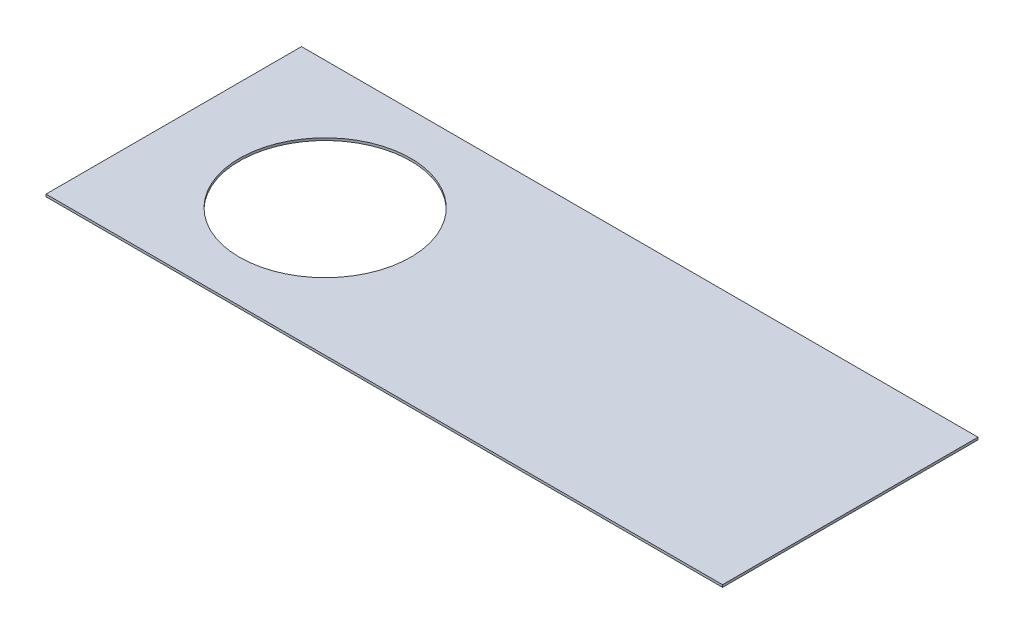
ISO-10303-21;
HEADER;
FILE_DESCRIPTION(('STEP AP214'),'2;1');
FILE_NAME('part.step','',(''),(''),'','','');
FILE_SCHEMA(('AUTOMOTIVE_DESIGN { 1 0 10303 214 1 1 1 1 }'));
ENDSEC;
DATA;
#1=APPLICATION_CONTEXT('core data for automotive mechanical design processes');
#2=APPLICATION_PROTOCOL_DEFINITION('international standard','automotive_design',2000,#1);
#3=PRODUCT_CONTEXT('',#1,'mechanical');
#4=PRODUCT('Part','Part','',(#3));
#5=PRODUCT_RELATED_PRODUCT_CATEGORY('part','',(#4));
#6=PRODUCT_DEFINITION_FORMATION('','',#4);
#7=PRODUCT_DEFINITION_CONTEXT('part definition',#1,'design');
#8=PRODUCT_DEFINITION('design','',#6,#7);
#9=PRODUCT_DEFINITION_SHAPE('','',#8);
#10=(LENGTH_UNIT() NAMED_UNIT(*) SI_UNIT(.MILLI.,.METRE.));
#11=(NAMED_UNIT(*) PLANE_ANGLE_UNIT() SI_UNIT($,.RADIAN.));
#12=(NAMED_UNIT(*) SI_UNIT($,.STERADIAN.) SOLID_ANGLE_UNIT());
#13=UNCERTAINTY_MEASURE_WITH_UNIT(LENGTH_MEASURE(1.E-05),#10,'distance_accuracy_value','');
#14=(GEOMETRIC_REPRESENTATION_CONTEXT(3) GLOBAL_UNCERTAINTY_ASSIGNED_CONTEXT((#13)) GLOBAL_UNIT_ASSIGNED_CONTEXT((#10,
#11,#12)) REPRESENTATION_CONTEXT('',''));
#15=CARTESIAN_POINT('',(0.,0.,0.));
#16=DIRECTION('',(0.,0.,1.));
#17=DIRECTION('',(1.,0.,0.));
#18=AXIS2_PLACEMENT_3D('',#15,#16,#17);
#19=CARTESIAN_POINT('',(0.,1.5875,0.));
#20=DIRECTION('',(1.,0.,0.));
#21=DIRECTION('',(0.,0.,-1.));
#22=AXIS2_PLACEMENT_3D('',#19,#20,#21);
#23=PLANE('',#22);
#24=DIRECTION('',(0.,0.,1.));
#25=VECTOR('',#24,1.);
#26=CARTESIAN_POINT('',(0.,0.,0.));
#27=LINE('',#26,#25);
#28=CARTESIAN_POINT('',(0.,0.,-171.45));
#29=VERTEX_POINT('',#28);
#30=CARTESIAN_POINT('',(0.,0.,0.));
#31=VERTEX_POINT('',#30);
#32=EDGE_CURVE('E105',#29,#31,#27,.T.);
#33=ORIENTED_EDGE('',*,*,#32,.T.);
#34=DIRECTION('',(0.,-1.,0.));
#35=VECTOR('',#34,1.);
#36=CARTESIAN_POINT('',(0.,1.5875,0.));
#37=LINE('',#36,#35);
#38=CARTESIAN_POINT('',(0.,1.5875,0.));
#39=VERTEX_POINT('',#38);
#40=EDGE_CURVE('E11',#39,#31,#37,.T.);
#41=ORIENTED_EDGE('',*,*,#40,.F.);
#42=DIRECTION('',(0.,0.,1.));
#43=VECTOR('',#42,1.);
#44=CARTESIAN_POINT('',(0.,1.5875,0.));
#45=LINE('',#44,#43);
#46=CARTESIAN_POINT('',(0.,1.5875,-171.45));
#47=VERTEX_POINT('',#46);
#48=EDGE_CURVE('E86',#47,#39,#45,.T.);
#49=ORIENTED_EDGE('',*,*,#48,.F.);
#50=DIRECTION('',(0.,-1.,0.));
#51=VECTOR('',#50,1.);
#52=CARTESIAN_POINT('',(0.,1.5875,-171.45));
#53=LINE('',#52,#51);
#54=EDGE_CURVE('E96',#47,#29,#53,.T.);
#55=ORIENTED_EDGE('',*,*,#54,.T.);
#56=EDGE_LOOP('',(#33,#41,#49,#55));
#57=FACE_BOUND('',#56,.T.);
#58=ADVANCED_FACE('F39',(#57),#23,.F.);
#59=CARTESIAN_POINT('',(0.,1.5875,0.));
#60=DIRECTION('',(0.,0.,-1.));
#61=DIRECTION('',(-1.,0.,0.));
#62=AXIS2_PLACEMENT_3D('',#59,#60,#61);
#63=PLANE('',#62);
#64=DIRECTION('',(1.,0.,0.));
#65=VECTOR('',#64,1.);
#66=CARTESIAN_POINT('',(0.,0.,0.));
#67=LINE('',#66,#65);
#68=CARTESIAN_POINT('',(454.025,0.,0.));
#69=VERTEX_POINT('',#68);
#70=EDGE_CURVE('E95',#31,#69,#67,.T.);
#71=ORIENTED_EDGE('',*,*,#70,.T.);
#72=DIRECTION('',(0.,-1.,0.));
#73=VECTOR('',#72,1.);
#74=CARTESIAN_POINT('',(454.025,1.5875,0.));
#75=LINE('',#74,#73);
#76=CARTESIAN_POINT('',(454.025,1.5875,0.));
#77=VERTEX_POINT('',#76);
#78=EDGE_CURVE('E50',#77,#69,#75,.T.);
#79=ORIENTED_EDGE('',*,*,#78,.F.);
#80=DIRECTION('',(1.,0.,0.));
#81=VECTOR('',#80,1.);
#82=CARTESIAN_POINT('',(0.,1.5875,0.));
#83=LINE('',#82,#81);
#84=EDGE_CURVE('E82',#39,#77,#83,.T.);
#85=ORIENTED_EDGE('',*,*,#84,.F.);
#86=ORIENTED_EDGE('',*,*,#40,.T.);
#87=EDGE_LOOP('',(#71,#79,#85,#86));
#88=FACE_BOUND('',#87,.T.);
#89=ADVANCED_FACE('F92',(#88),#63,.F.);
#90=CARTESIAN_POINT('',(454.025,1.5875,0.));
#91=DIRECTION('',(-1.,0.,0.));
#92=DIRECTION('',(0.,0.,1.));
#93=AXIS2_PLACEMENT_3D('',#90,#91,#92);
#94=PLANE('',#93);
#95=DIRECTION('',(0.,0.,-1.));
#96=VECTOR('',#95,1.);
#97=CARTESIAN_POINT('',(454.025,0.,0.));
#98=LINE('',#97,#96);
#99=CARTESIAN_POINT('',(454.025,0.,-171.45));
#100=VERTEX_POINT('',#99);
#101=EDGE_CURVE('E74',#69,#100,#98,.T.);
#102=ORIENTED_EDGE('',*,*,#101,.T.);
#103=DIRECTION('',(0.,-1.,0.));
#104=VECTOR('',#103,1.);
#105=CARTESIAN_POINT('',(454.025,1.5875,-171.45));
#106=LINE('',#105,#104);
#107=CARTESIAN_POINT('',(454.025,1.5875,-171.45));
#108=VERTEX_POINT('',#107);
#109=EDGE_CURVE('E91',#108,#100,#106,.T.);
#110=ORIENTED_EDGE('',*,*,#109,.F.);
#111=DIRECTION('',(0.,0.,-1.));
#112=VECTOR('',#111,1.);
#113=CARTESIAN_POINT('',(454.025,1.5875,0.));
#114=LINE('',#113,#112);
#115=EDGE_CURVE('E87',#77,#108,#114,.T.);
#116=ORIENTED_EDGE('',*,*,#115,.F.);
#117=ORIENTED_EDGE('',*,*,#78,.T.);
#118=EDGE_LOOP('',(#102,#110,#116,#117));
#119=FACE_BOUND('',#118,.T.);
#120=ADVANCED_FACE('F98',(#119),#94,.F.);
#121=CARTESIAN_POINT('',(0.,1.5875,-171.45));
#122=DIRECTION('',(0.,0.,1.));
#123=DIRECTION('',(1.,0.,0.));
#124=AXIS2_PLACEMENT_3D('',#121,#122,#123);
#125=PLANE('',#124);
#126=DIRECTION('',(-1.,0.,0.));
#127=VECTOR('',#126,1.);
#128=CARTESIAN_POINT('',(0.,0.,-171.45));
#129=LINE('',#128,#127);
#130=EDGE_CURVE('E76',#100,#29,#129,.T.);
#131=ORIENTED_EDGE('',*,*,#130,.T.);
#132=ORIENTED_EDGE('',*,*,#54,.F.);
#133=DIRECTION('',(-1.,0.,0.));
#134=VECTOR('',#133,1.);
#135=CARTESIAN_POINT('',(0.,1.5875,-171.45));
#136=LINE('',#135,#134);
#137=EDGE_CURVE('E54',#108,#47,#136,.T.);
#138=ORIENTED_EDGE('',*,*,#137,.F.);
#139=ORIENTED_EDGE('',*,*,#109,.T.);
#140=EDGE_LOOP('',(#131,#132,#138,#139));
#141=FACE_BOUND('',#140,.T.);
#142=ADVANCED_FACE('F109',(#141),#125,.F.);
#143=CARTESIAN_POINT('',(0.,1.5875,0.));
#144=DIRECTION('',(0.,-1.,0.));
#145=DIRECTION('',(0.,0.,-1.));
#146=AXIS2_PLACEMENT_3D('',#143,#144,#145);
#147=PLANE('',#146);
#148=CARTESIAN_POINT('',(101.6,1.5875,-85.725));
#149=DIRECTION('',(0.,1.,0.));
#150=DIRECTION('',(0.,0.,1.));
#151=AXIS2_PLACEMENT_3D('',#148,#149,#150);
#152=CIRCLE('',#151,57.5);
#153=CARTESIAN_POINT('',(101.6,1.5875,-28.225));
#154=VERTEX_POINT('',#153);
#155=EDGE_CURVE('E116',#154,#154,#152,.T.);
#156=ORIENTED_EDGE('',*,*,#155,.F.);
#157=EDGE_LOOP('',(#156));
#158=FACE_BOUND('',#157,.T.);
#159=ORIENTED_EDGE('',*,*,#48,.T.);
#160=ORIENTED_EDGE('',*,*,#84,.T.);
#161=ORIENTED_EDGE('',*,*,#115,.T.);
#162=ORIENTED_EDGE('',*,*,#137,.T.);
#163=EDGE_LOOP('',(#159,#160,#161,#162));
#164=FACE_BOUND('',#163,.T.);
#165=ADVANCED_FACE('F88',(#158,#164),#147,.F.);
#166=CARTESIAN_POINT('',(0.,0.,0.));
#167=DIRECTION('',(0.,-1.,0.));
#168=DIRECTION('',(0.,0.,-1.));
#169=AXIS2_PLACEMENT_3D('',#166,#167,#168);
#170=PLANE('',#169);
#171=CARTESIAN_POINT('',(101.6,0.,-85.725));
#172=DIRECTION('',(0.,1.,0.));
#173=DIRECTION('',(0.,0.,1.));
#174=AXIS2_PLACEMENT_3D('',#171,#172,#173);
#175=CIRCLE('',#174,57.5);
#176=CARTESIAN_POINT('',(101.6,0.,-28.225));
#177=VERTEX_POINT('',#176);
#178=EDGE_CURVE('E102',#177,#177,#175,.T.);
#179=ORIENTED_EDGE('',*,*,#178,.T.);
#180=EDGE_LOOP('',(#179));
#181=FACE_BOUND('',#180,.T.);
#182=ORIENTED_EDGE('',*,*,#32,.F.);
#183=ORIENTED_EDGE('',*,*,#130,.F.);
#184=ORIENTED_EDGE('',*,*,#101,.F.);
#185=ORIENTED_EDGE('',*,*,#70,.F.);
#186=EDGE_LOOP('',(#182,#183,#184,#185));
#187=FACE_BOUND('',#186,.T.);
#188=ADVANCED_FACE('F113',(#181,#187),#170,.T.);
#189=CARTESIAN_POINT('',(101.6,0.,-85.725));
#190=DIRECTION('',(0.,1.,0.));
#191=DIRECTION('',(0.,0.,1.));
#192=AXIS2_PLACEMENT_3D('',#189,#190,#191);
#193=CYLINDRICAL_SURFACE('',#192,57.5);
#194=ORIENTED_EDGE('',*,*,#178,.F.);
#195=EDGE_LOOP('',(#194));
#196=FACE_BOUND('',#195,.T.);
#197=ORIENTED_EDGE('',*,*,#155,.T.);
#198=EDGE_LOOP('',(#197));
#199=FACE_BOUND('',#198,.T.);
#200=ADVANCED_FACE('F124',(#196,#199),#193,.F.);
#201=CLOSED_SHELL('',(#58,#89,#120,#142,#165,#188,#200));
#202=MANIFOLD_SOLID_BREP('B2',#201);
#203=ADVANCED_BREP_SHAPE_REPRESENTATION('',(#18,#202),#14);
#204=SHAPE_DEFINITION_REPRESENTATION(#9,#203);
ENDSEC;
END-ISO-10303-21;
